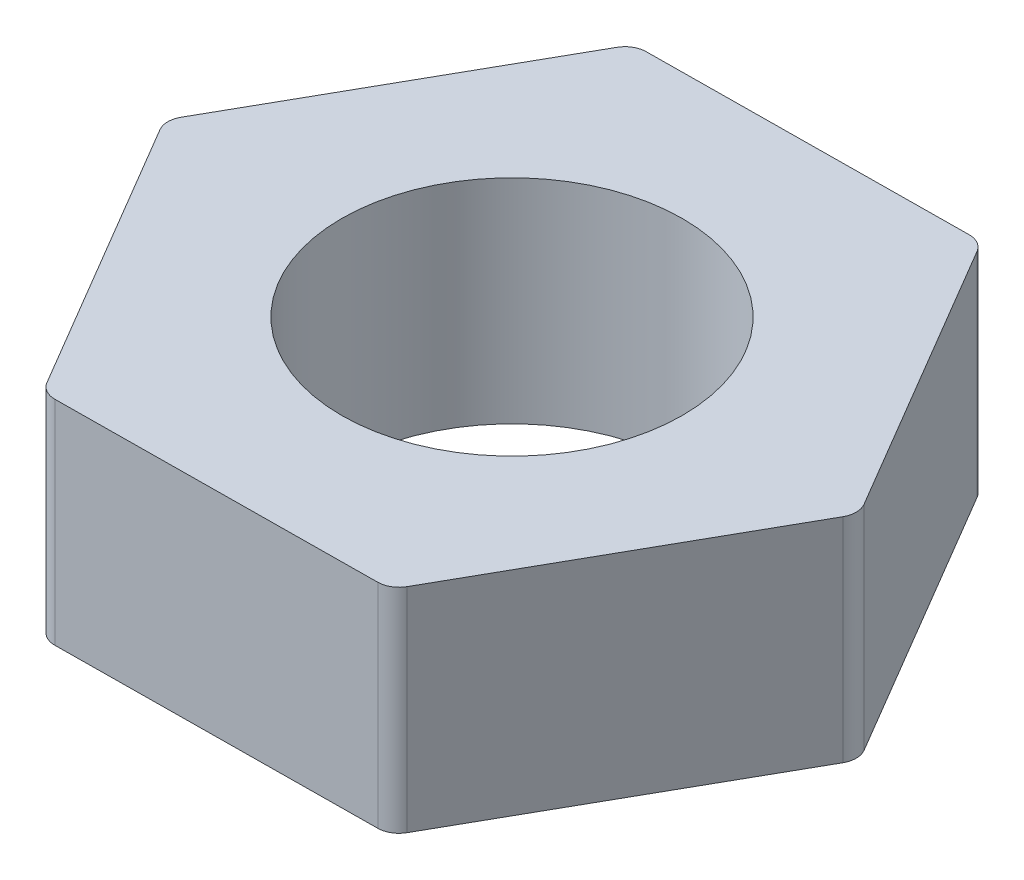
ISO-10303-21;
HEADER;
FILE_DESCRIPTION(('STEP AP214'),'2;1');
FILE_NAME('part.step','',(''),(''),'','','');
FILE_SCHEMA(('AUTOMOTIVE_DESIGN { 1 0 10303 214 1 1 1 1 }'));
ENDSEC;
DATA;
#1=APPLICATION_CONTEXT('core data for automotive mechanical design processes');
#2=APPLICATION_PROTOCOL_DEFINITION('international standard','automotive_design',2000,#1);
#3=PRODUCT_CONTEXT('',#1,'mechanical');
#4=PRODUCT('Part','Part','',(#3));
#5=PRODUCT_RELATED_PRODUCT_CATEGORY('part','',(#4));
#6=PRODUCT_DEFINITION_FORMATION('','',#4);
#7=PRODUCT_DEFINITION_CONTEXT('part definition',#1,'design');
#8=PRODUCT_DEFINITION('design','',#6,#7);
#9=PRODUCT_DEFINITION_SHAPE('','',#8);
#10=(LENGTH_UNIT() NAMED_UNIT(*) SI_UNIT(.MILLI.,.METRE.));
#11=(NAMED_UNIT(*) PLANE_ANGLE_UNIT() SI_UNIT($,.RADIAN.));
#12=(NAMED_UNIT(*) SI_UNIT($,.STERADIAN.) SOLID_ANGLE_UNIT());
#13=UNCERTAINTY_MEASURE_WITH_UNIT(LENGTH_MEASURE(1.E-05),#10,'distance_accuracy_value','');
#14=(GEOMETRIC_REPRESENTATION_CONTEXT(3) GLOBAL_UNCERTAINTY_ASSIGNED_CONTEXT((#13)) GLOBAL_UNIT_ASSIGNED_CONTEXT((#10,
#11,#12)) REPRESENTATION_CONTEXT('',''));
#15=CARTESIAN_POINT('',(0.,0.,0.));
#16=DIRECTION('',(0.,0.,1.));
#17=DIRECTION('',(1.,0.,0.));
#18=AXIS2_PLACEMENT_3D('',#15,#16,#17);
#19=CARTESIAN_POINT('',(4.04127729191506,2.5,-0.0375657182298955));
#20=DIRECTION('',(-0.861340438796271,0.,0.508028196554338));
#21=DIRECTION('',(0.508028196554338,0.,0.86134043879627));
#22=AXIS2_PLACEMENT_3D('',#19,#20,#21);
#23=PLANE('',#22);
#24=DIRECTION('',(-0.508028196554339,0.,-0.86134043879627));
#25=VECTOR('',#24,1.);
#26=CARTESIAN_POINT('',(4.04127729191506,2.5,-0.0375657182298955));
#27=LINE('',#26,#25);
#28=CARTESIAN_POINT('',(3.96794973790593,2.5,-0.161889501780657));
#29=VERTEX_POINT('',#28);
#30=CARTESIAN_POINT('',(2.06143333366829,2.5,-3.39430787409967));
#31=VERTEX_POINT('',#30);
#32=EDGE_CURVE('E162',#29,#31,#27,.T.);
#33=ORIENTED_EDGE('',*,*,#32,.F.);
#34=DIRECTION('',(0.,-1.,0.));
#35=VECTOR('',#34,1.);
#36=CARTESIAN_POINT('',(3.96794973790593,2.5,-0.161889501780657));
#37=LINE('',#36,#35);
#38=CARTESIAN_POINT('',(3.96794973790582,0.,-0.161889501780671));
#39=VERTEX_POINT('',#38);
#40=EDGE_CURVE('E197',#29,#39,#37,.T.);
#41=ORIENTED_EDGE('',*,*,#40,.T.);
#42=DIRECTION('',(-0.508028196554339,0.,-0.86134043879627));
#43=VECTOR('',#42,1.);
#44=CARTESIAN_POINT('',(4.04127729191495,0.,-0.0375657182298955));
#45=LINE('',#44,#43);
#46=CARTESIAN_POINT('',(2.06143333366821,0.,-3.39430787409967));
#47=VERTEX_POINT('',#46);
#48=EDGE_CURVE('E225',#39,#47,#45,.T.);
#49=ORIENTED_EDGE('',*,*,#48,.T.);
#50=DIRECTION('',(0.,-1.,0.));
#51=VECTOR('',#50,1.);
#52=CARTESIAN_POINT('',(2.06143333366829,2.5,-3.39430787409967));
#53=LINE('',#52,#51);
#54=EDGE_CURVE('E195',#47,#31,#53,.F.);
#55=ORIENTED_EDGE('',*,*,#54,.T.);
#56=EDGE_LOOP('',(#33,#41,#49,#55));
#57=FACE_BOUND('',#56,.T.);
#58=ADVANCED_FACE('F46',(#57),#23,.F.);
#59=CARTESIAN_POINT('',(1.98810577965911,2.5,-3.51863165765055));
#60=DIRECTION('',(0.00929510465671551,0.,0.999956799581575));
#61=DIRECTION('',(0.999956799581576,0.,-0.00929510465671557));
#62=AXIS2_PLACEMENT_3D('',#59,#60,#61);
#63=PLANE('',#62);
#64=DIRECTION('',(-0.999956799581576,0.,0.00929510465671557));
#65=VECTOR('',#64,1.);
#66=CARTESIAN_POINT('',(1.98810577965911,2.5,-3.51863165765055));
#67=LINE('',#66,#65);
#68=CARTESIAN_POINT('',(1.84377444780501,2.5,-3.51729002485658));
#69=VERTEX_POINT('',#68);
#70=CARTESIAN_POINT('',(-1.90884018040166,2.5,-3.48240757221441));
#71=VERTEX_POINT('',#70);
#72=EDGE_CURVE('E166',#69,#71,#67,.T.);
#73=ORIENTED_EDGE('',*,*,#72,.F.);
#74=DIRECTION('',(0.,-1.,0.));
#75=VECTOR('',#74,1.);
#76=CARTESIAN_POINT('',(1.84377444780501,2.5,-3.51729002485658));
#77=LINE('',#76,#75);
#78=CARTESIAN_POINT('',(1.84377444780498,0.,-3.51729002485657));
#79=VERTEX_POINT('',#78);
#80=EDGE_CURVE('E202',#69,#79,#77,.T.);
#81=ORIENTED_EDGE('',*,*,#80,.T.);
#82=DIRECTION('',(-0.999956799581576,0.,0.00929510465671557));
#83=VECTOR('',#82,1.);
#84=CARTESIAN_POINT('',(1.98810577965897,1.11022302462516E-13,-3.51863165765044));
#85=LINE('',#84,#83);
#86=CARTESIAN_POINT('',(-1.90884018040188,1.11022302462516E-13,-3.48240757221444));
#87=VERTEX_POINT('',#86);
#88=EDGE_CURVE('E223',#79,#87,#85,.T.);
#89=ORIENTED_EDGE('',*,*,#88,.T.);
#90=DIRECTION('',(0.,-1.,0.));
#91=VECTOR('',#90,1.);
#92=CARTESIAN_POINT('',(-1.90884018040166,2.5,-3.48240757221441));
#93=LINE('',#92,#91);
#94=EDGE_CURVE('E200',#87,#71,#93,.F.);
#95=ORIENTED_EDGE('',*,*,#94,.T.);
#96=EDGE_LOOP('',(#73,#81,#89,#95));
#97=FACE_BOUND('',#96,.T.);
#98=ADVANCED_FACE('F270',(#97),#63,.F.);
#99=CARTESIAN_POINT('',(-2.05317151225579,2.5,-3.48106593942057));
#100=DIRECTION('',(0.870635543452987,0.,0.491928603027236));
#101=DIRECTION('',(0.491928603027237,0.,-0.870635543452986));
#102=AXIS2_PLACEMENT_3D('',#99,#100,#101);
#103=PLANE('',#102);
#104=DIRECTION('',(-0.491928603027237,0.,0.870635543452986));
#105=VECTOR('',#104,1.);
#106=CARTESIAN_POINT('',(-2.05317151225579,2.5,-3.48106593942057));
#107=LINE('',#106,#105);
#108=CARTESIAN_POINT('',(-2.12417529010078,2.5,-3.35540052307594));
#109=VERTEX_POINT('',#108);
#110=CARTESIAN_POINT('',(-3.97027351406989,2.5,-0.0880996981147408));
#111=VERTEX_POINT('',#110);
#112=EDGE_CURVE('E217',#109,#111,#107,.T.);
#113=ORIENTED_EDGE('',*,*,#112,.F.);
#114=DIRECTION('',(0.,-1.,0.));
#115=VECTOR('',#114,1.);
#116=CARTESIAN_POINT('',(-2.12417529010078,2.5,-3.35540052307594));
#117=LINE('',#116,#115);
#118=CARTESIAN_POINT('',(-2.12417529010084,0.,-3.35540052307581));
#119=VERTEX_POINT('',#118);
#120=EDGE_CURVE('E207',#109,#119,#117,.T.);
#121=ORIENTED_EDGE('',*,*,#120,.T.);
#122=DIRECTION('',(-0.491928603027237,0.,0.870635543452986));
#123=VECTOR('',#122,1.);
#124=CARTESIAN_POINT('',(-2.05317151225581,0.,-3.48106593942057));
#125=LINE('',#124,#123);
#126=CARTESIAN_POINT('',(-3.97027351406998,0.,-0.088099698114727));
#127=VERTEX_POINT('',#126);
#128=EDGE_CURVE('E215',#119,#127,#125,.T.);
#129=ORIENTED_EDGE('',*,*,#128,.T.);
#130=DIRECTION('',(0.,-1.,0.));
#131=VECTOR('',#130,1.);
#132=CARTESIAN_POINT('',(-3.97027351406989,2.5,-0.0880996981147408));
#133=LINE('',#132,#131);
#134=EDGE_CURVE('E205',#127,#111,#133,.F.);
#135=ORIENTED_EDGE('',*,*,#134,.T.);
#136=EDGE_LOOP('',(#113,#121,#129,#135));
#137=FACE_BOUND('',#136,.T.);
#138=ADVANCED_FACE('F214',(#137),#103,.F.);
#139=CARTESIAN_POINT('',(-4.04127729191481,2.5,0.0375657182298678));
#140=DIRECTION('',(0.861340438796271,0.,-0.508028196554339));
#141=DIRECTION('',(-0.508028196554339,0.,-0.86134043879627));
#142=AXIS2_PLACEMENT_3D('',#139,#140,#141);
#143=PLANE('',#142);
#144=DIRECTION('',(0.508028196554339,0.,0.86134043879627));
#145=VECTOR('',#144,1.);
#146=CARTESIAN_POINT('',(-4.04127729191481,2.5,0.0375657182298678));
#147=LINE('',#146,#145);
#148=CARTESIAN_POINT('',(-3.96794973790573,2.5,0.161889501780532));
#149=VERTEX_POINT('',#148);
#150=CARTESIAN_POINT('',(-2.06143333366793,2.5,3.39430787409967));
#151=VERTEX_POINT('',#150);
#152=EDGE_CURVE('E235',#149,#151,#147,.T.);
#153=ORIENTED_EDGE('',*,*,#152,.F.);
#154=DIRECTION('',(0.,-1.,0.));
#155=VECTOR('',#154,1.);
#156=CARTESIAN_POINT('',(-3.96794973790573,2.5,0.161889501780532));
#157=LINE('',#156,#155);
#158=CARTESIAN_POINT('',(-3.96794973790582,0.,0.161889501780671));
#159=VERTEX_POINT('',#158);
#160=EDGE_CURVE('E13',#149,#159,#157,.T.);
#161=ORIENTED_EDGE('',*,*,#160,.T.);
#162=DIRECTION('',(0.508028196554339,0.,0.86134043879627));
#163=VECTOR('',#162,1.);
#164=CARTESIAN_POINT('',(-4.04127729191484,0.,0.0375657182298955));
#165=LINE('',#164,#163);
#166=CARTESIAN_POINT('',(-2.06143333366798,0.,3.39430787409967));
#167=VERTEX_POINT('',#166);
#168=EDGE_CURVE('E168',#159,#167,#165,.T.);
#169=ORIENTED_EDGE('',*,*,#168,.T.);
#170=DIRECTION('',(0.,-1.,0.));
#171=VECTOR('',#170,1.);
#172=CARTESIAN_POINT('',(-2.06143333366793,2.5,3.39430787409967));
#173=LINE('',#172,#171);
#174=EDGE_CURVE('E54',#167,#151,#173,.F.);
#175=ORIENTED_EDGE('',*,*,#174,.T.);
#176=EDGE_LOOP('',(#153,#161,#169,#175));
#177=FACE_BOUND('',#176,.T.);
#178=ADVANCED_FACE('F262',(#177),#143,.F.);
#179=CARTESIAN_POINT('',(-1.98810577965883,2.5,3.51863165765041));
#180=DIRECTION('',(-0.00929510465671579,0.,-0.999956799581575));
#181=DIRECTION('',(-0.999956799581576,0.,0.00929510465671551));
#182=AXIS2_PLACEMENT_3D('',#179,#180,#181);
#183=PLANE('',#182);
#184=DIRECTION('',(0.999956799581576,0.,-0.00929510465671579));
#185=VECTOR('',#184,1.);
#186=CARTESIAN_POINT('',(-1.98810577965883,0.,3.51863165765046));
#187=LINE('',#186,#185);
#188=CARTESIAN_POINT('',(-1.8437744478047,0.,3.51729002485654));
#189=VERTEX_POINT('',#188);
#190=CARTESIAN_POINT('',(1.90884018040199,0.,3.48240757221441));
#191=VERTEX_POINT('',#190);
#192=EDGE_CURVE('E163',#189,#191,#187,.T.);
#193=ORIENTED_EDGE('',*,*,#192,.T.);
#194=DIRECTION('',(0.,-1.,0.));
#195=VECTOR('',#194,1.);
#196=CARTESIAN_POINT('',(1.90884018040199,2.5,3.48240757221441));
#197=LINE('',#196,#195);
#198=CARTESIAN_POINT('',(1.90884018040199,2.5,3.48240757221441));
#199=VERTEX_POINT('',#198);
#200=EDGE_CURVE('E141',#191,#199,#197,.F.);
#201=ORIENTED_EDGE('',*,*,#200,.T.);
#202=DIRECTION('',(0.999956799581576,0.,-0.00929510465671579));
#203=VECTOR('',#202,1.);
#204=CARTESIAN_POINT('',(-1.98810577965883,2.5,3.51863165765041));
#205=LINE('',#204,#203);
#206=CARTESIAN_POINT('',(-1.8437744478047,2.5,3.51729002485654));
#207=VERTEX_POINT('',#206);
#208=EDGE_CURVE('E232',#207,#199,#205,.T.);
#209=ORIENTED_EDGE('',*,*,#208,.F.);
#210=DIRECTION('',(0.,-1.,0.));
#211=VECTOR('',#210,1.);
#212=CARTESIAN_POINT('',(-1.8437744478047,2.5,3.51729002485654));
#213=LINE('',#212,#211);
#214=EDGE_CURVE('E146',#207,#189,#213,.T.);
#215=ORIENTED_EDGE('',*,*,#214,.T.);
#216=EDGE_LOOP('',(#193,#201,#209,#215));
#217=FACE_BOUND('',#216,.T.);
#218=ADVANCED_FACE('F260',(#217),#183,.F.);
#219=CARTESIAN_POINT('',(2.05317151225606,2.5,3.48106593942055));
#220=DIRECTION('',(-0.870635543452987,0.,-0.491928603027236));
#221=DIRECTION('',(-0.491928603027237,0.,0.870635543452987));
#222=AXIS2_PLACEMENT_3D('',#219,#220,#221);
#223=PLANE('',#222);
#224=DIRECTION('',(0.491928603027237,0.,-0.870635543452986));
#225=VECTOR('',#224,1.);
#226=CARTESIAN_POINT('',(2.05317151225606,2.5,3.48106593942055));
#227=LINE('',#226,#225);
#228=CARTESIAN_POINT('',(2.124175290101,2.5,3.35540052307592));
#229=VERTEX_POINT('',#228);
#230=CARTESIAN_POINT('',(3.97027351407003,2.50000000000006,0.0880996981147131));
#231=VERTEX_POINT('',#230);
#232=EDGE_CURVE('E156',#229,#231,#227,.T.);
#233=ORIENTED_EDGE('',*,*,#232,.F.);
#234=DIRECTION('',(0.,-1.,0.));
#235=VECTOR('',#234,1.);
#236=CARTESIAN_POINT('',(2.124175290101,2.5,3.35540052307592));
#237=LINE('',#236,#235);
#238=CARTESIAN_POINT('',(2.124175290101,0.,3.35540052307592));
#239=VERTEX_POINT('',#238);
#240=EDGE_CURVE('E140',#229,#239,#237,.T.);
#241=ORIENTED_EDGE('',*,*,#240,.T.);
#242=DIRECTION('',(0.491928603027237,0.,-0.870635543452986));
#243=VECTOR('',#242,1.);
#244=CARTESIAN_POINT('',(2.05317151225606,0.,3.48106593942055));
#245=LINE('',#244,#243);
#246=CARTESIAN_POINT('',(3.97027351407003,0.,0.0880996981147131));
#247=VERTEX_POINT('',#246);
#248=EDGE_CURVE('E153',#239,#247,#245,.T.);
#249=ORIENTED_EDGE('',*,*,#248,.T.);
#250=DIRECTION('',(0.,-1.,0.));
#251=VECTOR('',#250,1.);
#252=CARTESIAN_POINT('',(3.97027351407003,2.50000000000006,0.0880996981147131));
#253=LINE('',#252,#251);
#254=EDGE_CURVE('E158',#247,#231,#253,.F.);
#255=ORIENTED_EDGE('',*,*,#254,.T.);
#256=EDGE_LOOP('',(#233,#241,#249,#255));
#257=FACE_BOUND('',#256,.T.);
#258=ADVANCED_FACE('F152',(#257),#223,.F.);
#259=CARTESIAN_POINT('',(1.66533453693773E-13,2.5,0.));
#260=DIRECTION('',(0.,1.,0.));
#261=DIRECTION('',(0.,0.,1.));
#262=AXIS2_PLACEMENT_3D('',#259,#260,#261);
#263=PLANE('',#262);
#264=CARTESIAN_POINT('',(1.66533453693773E-13,2.5,0.));
#265=DIRECTION('',(0.,1.,0.));
#266=DIRECTION('',(0.,0.,1.));
#267=AXIS2_PLACEMENT_3D('',#264,#265,#266);
#268=CIRCLE('',#267,2.);
#269=CARTESIAN_POINT('',(1.66533453693773E-13,2.5,1.99999999999998));
#270=VERTEX_POINT('',#269);
#271=EDGE_CURVE('E240',#270,#270,#268,.T.);
#272=ORIENTED_EDGE('',*,*,#271,.F.);
#273=EDGE_LOOP('',(#272));
#274=FACE_BOUND('',#273,.T.);
#275=ORIENTED_EDGE('',*,*,#208,.T.);
#276=CARTESIAN_POINT('',(1.90651640423789,2.5,3.232418372319));
#277=DIRECTION('',(0.,1.,0.));
#278=DIRECTION('',(0.,0.,1.));
#279=AXIS2_PLACEMENT_3D('',#276,#277,#278);
#280=CIRCLE('',#279,0.25);
#281=EDGE_CURVE('E193',#199,#229,#280,.T.);
#282=ORIENTED_EDGE('',*,*,#281,.T.);
#283=ORIENTED_EDGE('',*,*,#232,.T.);
#284=CARTESIAN_POINT('',(3.75261462820692,2.50000000000006,-0.0348824526420627));
#285=DIRECTION('',(0.,1.,0.));
#286=DIRECTION('',(0.,0.,1.));
#287=AXIS2_PLACEMENT_3D('',#284,#285,#286);
#288=CIRCLE('',#287,0.25);
#289=EDGE_CURVE('E191',#231,#29,#288,.T.);
#290=ORIENTED_EDGE('',*,*,#289,.T.);
#291=ORIENTED_EDGE('',*,*,#32,.T.);
#292=CARTESIAN_POINT('',(1.84609822396919,2.5,-3.26730082496123));
#293=DIRECTION('',(0.,1.,0.));
#294=DIRECTION('',(0.,0.,1.));
#295=AXIS2_PLACEMENT_3D('',#292,#293,#294);
#296=CIRCLE('',#295,0.25);
#297=EDGE_CURVE('E189',#31,#69,#296,.T.);
#298=ORIENTED_EDGE('',*,*,#297,.T.);
#299=ORIENTED_EDGE('',*,*,#72,.T.);
#300=CARTESIAN_POINT('',(-1.90651640423745,2.5,-3.23241837231913));
#301=DIRECTION('',(0.,1.,0.));
#302=DIRECTION('',(0.,0.,1.));
#303=AXIS2_PLACEMENT_3D('',#300,#301,#302);
#304=CIRCLE('',#303,0.25);
#305=EDGE_CURVE('E187',#71,#109,#304,.T.);
#306=ORIENTED_EDGE('',*,*,#305,.T.);
#307=ORIENTED_EDGE('',*,*,#112,.T.);
#308=CARTESIAN_POINT('',(-3.75261462820659,2.5,0.0348824526419378));
#309=DIRECTION('',(0.,1.,0.));
#310=DIRECTION('',(0.,0.,1.));
#311=AXIS2_PLACEMENT_3D('',#308,#309,#310);
#312=CIRCLE('',#311,0.25);
#313=EDGE_CURVE('E67',#111,#149,#312,.T.);
#314=ORIENTED_EDGE('',*,*,#313,.T.);
#315=ORIENTED_EDGE('',*,*,#152,.T.);
#316=CARTESIAN_POINT('',(-1.84609822396886,2.5,3.26730082496117));
#317=DIRECTION('',(0.,1.,0.));
#318=DIRECTION('',(0.,0.,1.));
#319=AXIS2_PLACEMENT_3D('',#316,#317,#318);
#320=CIRCLE('',#319,0.25);
#321=EDGE_CURVE('E184',#151,#207,#320,.T.);
#322=ORIENTED_EDGE('',*,*,#321,.T.);
#323=EDGE_LOOP('',(#275,#282,#283,#290,#291,#298,#299,#306,#307,#314,#315,#322));
#324=FACE_BOUND('',#323,.T.);
#325=ADVANCED_FACE('F253',(#274,#324),#263,.T.);
#326=CARTESIAN_POINT('',(0.,0.,0.));
#327=DIRECTION('',(0.,1.,0.));
#328=DIRECTION('',(0.,0.,1.));
#329=AXIS2_PLACEMENT_3D('',#326,#327,#328);
#330=PLANE('',#329);
#331=CARTESIAN_POINT('',(0.,0.,0.));
#332=DIRECTION('',(0.,1.,0.));
#333=DIRECTION('',(0.,0.,1.));
#334=AXIS2_PLACEMENT_3D('',#331,#332,#333);
#335=CIRCLE('',#334,2.);
#336=CARTESIAN_POINT('',(0.,0.,2.00000000000001));
#337=VERTEX_POINT('',#336);
#338=EDGE_CURVE('E230',#337,#337,#335,.T.);
#339=ORIENTED_EDGE('',*,*,#338,.T.);
#340=EDGE_LOOP('',(#339));
#341=FACE_BOUND('',#340,.T.);
#342=ORIENTED_EDGE('',*,*,#248,.F.);
#343=CARTESIAN_POINT('',(1.90651640423781,0.,3.23241837231912));
#344=DIRECTION('',(0.,1.,0.));
#345=DIRECTION('',(0.,0.,1.));
#346=AXIS2_PLACEMENT_3D('',#343,#344,#345);
#347=CIRCLE('',#346,0.25);
#348=EDGE_CURVE('E136',#239,#191,#347,.F.);
#349=ORIENTED_EDGE('',*,*,#348,.T.);
#350=ORIENTED_EDGE('',*,*,#192,.F.);
#351=CARTESIAN_POINT('',(-1.84609822396894,0.,3.26730082496121));
#352=DIRECTION('',(0.,1.,0.));
#353=DIRECTION('',(0.,0.,1.));
#354=AXIS2_PLACEMENT_3D('',#351,#352,#353);
#355=CIRCLE('',#354,0.25);
#356=EDGE_CURVE('E157',#189,#167,#355,.F.);
#357=ORIENTED_EDGE('',*,*,#356,.T.);
#358=ORIENTED_EDGE('',*,*,#168,.F.);
#359=CARTESIAN_POINT('',(-3.7526146282067,0.,0.0348824526420211));
#360=DIRECTION('',(0.,1.,0.));
#361=DIRECTION('',(0.,0.,1.));
#362=AXIS2_PLACEMENT_3D('',#359,#360,#361);
#363=CIRCLE('',#362,0.25);
#364=EDGE_CURVE('E174',#159,#127,#363,.F.);
#365=ORIENTED_EDGE('',*,*,#364,.T.);
#366=ORIENTED_EDGE('',*,*,#128,.F.);
#367=CARTESIAN_POINT('',(-1.90651640423767,0.,-3.23241837231904));
#368=DIRECTION('',(0.,1.,0.));
#369=DIRECTION('',(0.,0.,1.));
#370=AXIS2_PLACEMENT_3D('',#367,#368,#369);
#371=CIRCLE('',#370,0.25);
#372=EDGE_CURVE('E176',#119,#87,#371,.F.);
#373=ORIENTED_EDGE('',*,*,#372,.T.);
#374=ORIENTED_EDGE('',*,*,#88,.F.);
#375=CARTESIAN_POINT('',(1.84609822396903,0.,-3.26730082496118));
#376=DIRECTION('',(0.,1.,0.));
#377=DIRECTION('',(0.,0.,1.));
#378=AXIS2_PLACEMENT_3D('',#375,#376,#377);
#379=CIRCLE('',#378,0.25);
#380=EDGE_CURVE('E178',#79,#47,#379,.F.);
#381=ORIENTED_EDGE('',*,*,#380,.T.);
#382=ORIENTED_EDGE('',*,*,#48,.F.);
#383=CARTESIAN_POINT('',(3.7526146282067,0.,-0.0348824526420766));
#384=DIRECTION('',(0.,1.,0.));
#385=DIRECTION('',(0.,0.,1.));
#386=AXIS2_PLACEMENT_3D('',#383,#384,#385);
#387=CIRCLE('',#386,0.25);
#388=EDGE_CURVE('E147',#39,#247,#387,.F.);
#389=ORIENTED_EDGE('',*,*,#388,.T.);
#390=EDGE_LOOP('',(#342,#349,#350,#357,#358,#365,#366,#373,#374,#381,#382,#389));
#391=FACE_BOUND('',#390,.T.);
#392=ADVANCED_FACE('F160',(#341,#391),#330,.F.);
#393=CARTESIAN_POINT('',(0.,0.,0.));
#394=DIRECTION('',(0.,1.,0.));
#395=DIRECTION('',(0.,0.,1.));
#396=AXIS2_PLACEMENT_3D('',#393,#394,#395);
#397=CYLINDRICAL_SURFACE('',#396,2.);
#398=ORIENTED_EDGE('',*,*,#338,.F.);
#399=EDGE_LOOP('',(#398));
#400=FACE_BOUND('',#399,.T.);
#401=ORIENTED_EDGE('',*,*,#271,.T.);
#402=EDGE_LOOP('',(#401));
#403=FACE_BOUND('',#402,.T.);
#404=ADVANCED_FACE('F247',(#400,#403),#397,.F.);
#405=CARTESIAN_POINT('',(1.90651640423789,2.5,3.232418372319));
#406=DIRECTION('',(0.,-1.,0.));
#407=DIRECTION('',(0.,0.,-1.));
#408=AXIS2_PLACEMENT_3D('',#405,#406,#407);
#409=CYLINDRICAL_SURFACE('',#408,0.25);
#410=ORIENTED_EDGE('',*,*,#281,.F.);
#411=ORIENTED_EDGE('',*,*,#200,.F.);
#412=ORIENTED_EDGE('',*,*,#348,.F.);
#413=ORIENTED_EDGE('',*,*,#240,.F.);
#414=EDGE_LOOP('',(#410,#411,#412,#413));
#415=FACE_BOUND('',#414,.T.);
#416=ADVANCED_FACE('F139',(#415),#409,.T.);
#417=CARTESIAN_POINT('',(3.75261462820692,2.50000000000006,-0.0348824526420627));
#418=DIRECTION('',(0.,-1.,0.));
#419=DIRECTION('',(0.,0.,-1.));
#420=AXIS2_PLACEMENT_3D('',#417,#418,#419);
#421=CYLINDRICAL_SURFACE('',#420,0.25);
#422=ORIENTED_EDGE('',*,*,#289,.F.);
#423=ORIENTED_EDGE('',*,*,#254,.F.);
#424=ORIENTED_EDGE('',*,*,#388,.F.);
#425=ORIENTED_EDGE('',*,*,#40,.F.);
#426=EDGE_LOOP('',(#422,#423,#424,#425));
#427=FACE_BOUND('',#426,.T.);
#428=ADVANCED_FACE('F281',(#427),#421,.T.);
#429=CARTESIAN_POINT('',(1.84609822396919,2.5,-3.26730082496123));
#430=DIRECTION('',(0.,-1.,0.));
#431=DIRECTION('',(0.,0.,-1.));
#432=AXIS2_PLACEMENT_3D('',#429,#430,#431);
#433=CYLINDRICAL_SURFACE('',#432,0.25);
#434=ORIENTED_EDGE('',*,*,#297,.F.);
#435=ORIENTED_EDGE('',*,*,#54,.F.);
#436=ORIENTED_EDGE('',*,*,#380,.F.);
#437=ORIENTED_EDGE('',*,*,#80,.F.);
#438=EDGE_LOOP('',(#434,#435,#436,#437));
#439=FACE_BOUND('',#438,.T.);
#440=ADVANCED_FACE('F278',(#439),#433,.T.);
#441=CARTESIAN_POINT('',(-1.90651640423745,2.5,-3.23241837231913));
#442=DIRECTION('',(0.,-1.,0.));
#443=DIRECTION('',(0.,0.,-1.));
#444=AXIS2_PLACEMENT_3D('',#441,#442,#443);
#445=CYLINDRICAL_SURFACE('',#444,0.25);
#446=ORIENTED_EDGE('',*,*,#305,.F.);
#447=ORIENTED_EDGE('',*,*,#94,.F.);
#448=ORIENTED_EDGE('',*,*,#372,.F.);
#449=ORIENTED_EDGE('',*,*,#120,.F.);
#450=EDGE_LOOP('',(#446,#447,#448,#449));
#451=FACE_BOUND('',#450,.T.);
#452=ADVANCED_FACE('F268',(#451),#445,.T.);
#453=CARTESIAN_POINT('',(-3.75261462820659,2.5,0.0348824526419378));
#454=DIRECTION('',(0.,-1.,0.));
#455=DIRECTION('',(0.,0.,-1.));
#456=AXIS2_PLACEMENT_3D('',#453,#454,#455);
#457=CYLINDRICAL_SURFACE('',#456,0.25);
#458=ORIENTED_EDGE('',*,*,#313,.F.);
#459=ORIENTED_EDGE('',*,*,#134,.F.);
#460=ORIENTED_EDGE('',*,*,#364,.F.);
#461=ORIENTED_EDGE('',*,*,#160,.F.);
#462=EDGE_LOOP('',(#458,#459,#460,#461));
#463=FACE_BOUND('',#462,.T.);
#464=ADVANCED_FACE('F265',(#463),#457,.T.);
#465=CARTESIAN_POINT('',(-1.84609822396886,2.5,3.26730082496117));
#466=DIRECTION('',(0.,-1.,0.));
#467=DIRECTION('',(0.,0.,-1.));
#468=AXIS2_PLACEMENT_3D('',#465,#466,#467);
#469=CYLINDRICAL_SURFACE('',#468,0.25);
#470=ORIENTED_EDGE('',*,*,#321,.F.);
#471=ORIENTED_EDGE('',*,*,#174,.F.);
#472=ORIENTED_EDGE('',*,*,#356,.F.);
#473=ORIENTED_EDGE('',*,*,#214,.F.);
#474=EDGE_LOOP('',(#470,#471,#472,#473));
#475=FACE_BOUND('',#474,.T.);
#476=ADVANCED_FACE('F48',(#475),#469,.T.);
#477=CLOSED_SHELL('',(#58,#98,#138,#178,#218,#258,#325,#392,#404,#416,#428,#440,#452,#464,#476));
#478=MANIFOLD_SOLID_BREP('B2',#477);
#479=ADVANCED_BREP_SHAPE_REPRESENTATION('',(#18,#478),#14);
#480=SHAPE_DEFINITION_REPRESENTATION(#9,#479);
ENDSEC;
END-ISO-10303-21;
